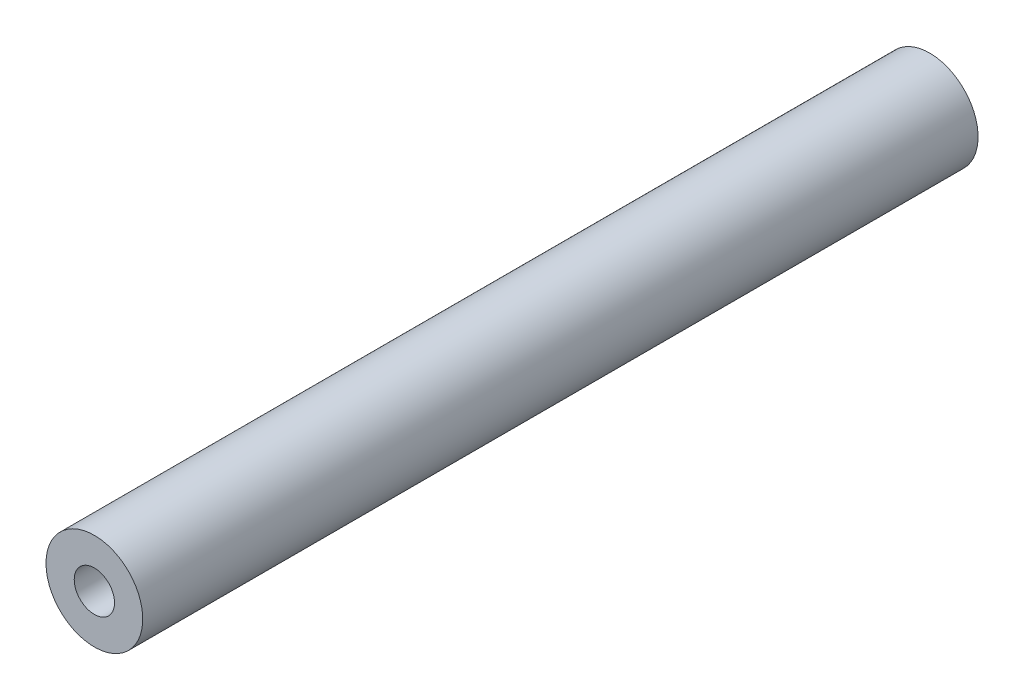
ISO-10303-21;
HEADER;
FILE_DESCRIPTION(('STEP AP214'),'2;1');
FILE_NAME('part.step','',(''),(''),'','','');
FILE_SCHEMA(('AUTOMOTIVE_DESIGN { 1 0 10303 214 1 1 1 1 }'));
ENDSEC;
DATA;
#1=APPLICATION_CONTEXT('core data for automotive mechanical design processes');
#2=APPLICATION_PROTOCOL_DEFINITION('international standard','automotive_design',2000,#1);
#3=PRODUCT_CONTEXT('',#1,'mechanical');
#4=PRODUCT('Part','Part','',(#3));
#5=PRODUCT_RELATED_PRODUCT_CATEGORY('part','',(#4));
#6=PRODUCT_DEFINITION_FORMATION('','',#4);
#7=PRODUCT_DEFINITION_CONTEXT('part definition',#1,'design');
#8=PRODUCT_DEFINITION('design','',#6,#7);
#9=PRODUCT_DEFINITION_SHAPE('','',#8);
#10=(LENGTH_UNIT() NAMED_UNIT(*) SI_UNIT(.MILLI.,.METRE.));
#11=(NAMED_UNIT(*) PLANE_ANGLE_UNIT() SI_UNIT($,.RADIAN.));
#12=(NAMED_UNIT(*) SI_UNIT($,.STERADIAN.) SOLID_ANGLE_UNIT());
#13=UNCERTAINTY_MEASURE_WITH_UNIT(LENGTH_MEASURE(1.E-05),#10,'distance_accuracy_value','');
#14=(GEOMETRIC_REPRESENTATION_CONTEXT(3) GLOBAL_UNCERTAINTY_ASSIGNED_CONTEXT((#13)) GLOBAL_UNIT_ASSIGNED_CONTEXT((#10,
#11,#12)) REPRESENTATION_CONTEXT('',''));
#15=CARTESIAN_POINT('',(0.,0.,0.));
#16=DIRECTION('',(0.,0.,1.));
#17=DIRECTION('',(1.,0.,0.));
#18=AXIS2_PLACEMENT_3D('',#15,#16,#17);
#19=CARTESIAN_POINT('',(0.,0.,51.8));
#20=DIRECTION('',(0.,0.,1.));
#21=DIRECTION('',(1.,0.,0.));
#22=AXIS2_PLACEMENT_3D('',#19,#20,#21);
#23=PLANE('',#22);
#24=CARTESIAN_POINT('',(0.,0.,51.8));
#25=DIRECTION('',(0.,0.,1.));
#26=DIRECTION('',(1.,0.,0.));
#27=AXIS2_PLACEMENT_3D('',#24,#25,#26);
#28=CIRCLE('',#27,3.);
#29=CARTESIAN_POINT('',(-3.,0.,51.8));
#30=VERTEX_POINT('',#29);
#31=EDGE_CURVE('E10',#30,#30,#28,.T.);
#32=ORIENTED_EDGE('',*,*,#31,.T.);
#33=EDGE_LOOP('',(#32));
#34=FACE_BOUND('',#33,.T.);
#35=CARTESIAN_POINT('',(0.,0.,51.8));
#36=DIRECTION('',(0.,0.,1.));
#37=DIRECTION('',(1.,0.,0.));
#38=AXIS2_PLACEMENT_3D('',#35,#36,#37);
#39=CIRCLE('',#38,1.25);
#40=CARTESIAN_POINT('',(-1.25,0.,51.8));
#41=VERTEX_POINT('',#40);
#42=EDGE_CURVE('E52',#41,#41,#39,.T.);
#43=ORIENTED_EDGE('',*,*,#42,.F.);
#44=EDGE_LOOP('',(#43));
#45=FACE_BOUND('',#44,.T.);
#46=ADVANCED_FACE('F39',(#34,#45),#23,.T.);
#47=CARTESIAN_POINT('',(0.,0.,0.));
#48=DIRECTION('',(0.,0.,1.));
#49=DIRECTION('',(1.,0.,0.));
#50=AXIS2_PLACEMENT_3D('',#47,#48,#49);
#51=PLANE('',#50);
#52=CARTESIAN_POINT('',(0.,0.,0.));
#53=DIRECTION('',(0.,0.,1.));
#54=DIRECTION('',(1.,0.,0.));
#55=AXIS2_PLACEMENT_3D('',#52,#53,#54);
#56=CIRCLE('',#55,3.);
#57=CARTESIAN_POINT('',(-3.,0.,0.));
#58=VERTEX_POINT('',#57);
#59=EDGE_CURVE('E43',#58,#58,#56,.T.);
#60=ORIENTED_EDGE('',*,*,#59,.F.);
#61=EDGE_LOOP('',(#60));
#62=FACE_BOUND('',#61,.T.);
#63=CARTESIAN_POINT('',(0.,0.,0.));
#64=DIRECTION('',(0.,0.,1.));
#65=DIRECTION('',(1.,0.,0.));
#66=AXIS2_PLACEMENT_3D('',#63,#64,#65);
#67=CIRCLE('',#66,1.25);
#68=CARTESIAN_POINT('',(-1.25,0.,0.));
#69=VERTEX_POINT('',#68);
#70=EDGE_CURVE('E54',#69,#69,#67,.T.);
#71=ORIENTED_EDGE('',*,*,#70,.T.);
#72=EDGE_LOOP('',(#71));
#73=FACE_BOUND('',#72,.T.);
#74=ADVANCED_FACE('F66',(#62,#73),#51,.F.);
#75=CARTESIAN_POINT('',(0.,0.,51.8));
#76=DIRECTION('',(0.,0.,-1.));
#77=DIRECTION('',(-1.,0.,0.));
#78=AXIS2_PLACEMENT_3D('',#75,#76,#77);
#79=CYLINDRICAL_SURFACE('',#78,3.);
#80=CARTESIAN_POINT('',(-3.,0.,51.8));
#81=CARTESIAN_POINT('',(-3.,0.,51.2604166666667));
#82=CARTESIAN_POINT('',(-3.,0.,50.7208333333333));
#83=CARTESIAN_POINT('',(-3.,0.,49.6416666666667));
#84=CARTESIAN_POINT('',(-3.,0.,49.1020833333333));
#85=CARTESIAN_POINT('',(-3.,0.,48.0229166666667));
#86=CARTESIAN_POINT('',(-3.,0.,47.4833333333333));
#87=CARTESIAN_POINT('',(-3.,0.,46.4041666666667));
#88=CARTESIAN_POINT('',(-3.,0.,45.8645833333333));
#89=CARTESIAN_POINT('',(-3.,0.,44.7854166666667));
#90=CARTESIAN_POINT('',(-3.,0.,44.2458333333333));
#91=CARTESIAN_POINT('',(-3.,0.,43.1666666666667));
#92=CARTESIAN_POINT('',(-3.,0.,42.6270833333333));
#93=CARTESIAN_POINT('',(-3.,0.,41.5479166666667));
#94=CARTESIAN_POINT('',(-3.,0.,41.0083333333333));
#95=CARTESIAN_POINT('',(-3.,0.,39.9291666666667));
#96=CARTESIAN_POINT('',(-3.,0.,39.3895833333333));
#97=CARTESIAN_POINT('',(-3.,0.,38.3104166666667));
#98=CARTESIAN_POINT('',(-3.,0.,37.7708333333333));
#99=CARTESIAN_POINT('',(-3.,0.,36.6916666666667));
#100=CARTESIAN_POINT('',(-3.,0.,36.1520833333333));
#101=CARTESIAN_POINT('',(-3.,0.,35.0729166666667));
#102=CARTESIAN_POINT('',(-3.,0.,34.5333333333333));
#103=CARTESIAN_POINT('',(-3.,0.,33.4541666666667));
#104=CARTESIAN_POINT('',(-3.,0.,32.9145833333333));
#105=CARTESIAN_POINT('',(-3.,0.,31.8354166666667));
#106=CARTESIAN_POINT('',(-3.,0.,31.2958333333333));
#107=CARTESIAN_POINT('',(-3.,0.,30.2166666666667));
#108=CARTESIAN_POINT('',(-3.,0.,29.6770833333333));
#109=CARTESIAN_POINT('',(-3.,0.,28.5979166666667));
#110=CARTESIAN_POINT('',(-3.,0.,28.0583333333333));
#111=CARTESIAN_POINT('',(-3.,0.,26.9791666666667));
#112=CARTESIAN_POINT('',(-3.,0.,26.4395833333333));
#113=CARTESIAN_POINT('',(-3.,0.,25.3604166666667));
#114=CARTESIAN_POINT('',(-3.,0.,24.8208333333333));
#115=CARTESIAN_POINT('',(-3.,0.,23.7416666666667));
#116=CARTESIAN_POINT('',(-3.,0.,23.2020833333333));
#117=CARTESIAN_POINT('',(-3.,0.,22.1229166666667));
#118=CARTESIAN_POINT('',(-3.,0.,21.5833333333333));
#119=CARTESIAN_POINT('',(-3.,0.,20.5041666666667));
#120=CARTESIAN_POINT('',(-3.,0.,19.9645833333333));
#121=CARTESIAN_POINT('',(-3.,0.,18.8854166666667));
#122=CARTESIAN_POINT('',(-3.,0.,18.3458333333333));
#123=CARTESIAN_POINT('',(-3.,0.,17.2666666666667));
#124=CARTESIAN_POINT('',(-3.,0.,16.7270833333333));
#125=CARTESIAN_POINT('',(-3.,0.,15.6479166666667));
#126=CARTESIAN_POINT('',(-3.,0.,15.1083333333333));
#127=CARTESIAN_POINT('',(-3.,0.,14.0291666666667));
#128=CARTESIAN_POINT('',(-3.,0.,13.4895833333333));
#129=CARTESIAN_POINT('',(-3.,0.,12.4104166666667));
#130=CARTESIAN_POINT('',(-3.,0.,11.8708333333333));
#131=CARTESIAN_POINT('',(-3.,0.,10.7916666666667));
#132=CARTESIAN_POINT('',(-3.,0.,10.2520833333333));
#133=CARTESIAN_POINT('',(-3.,0.,9.17291666666666));
#134=CARTESIAN_POINT('',(-3.,0.,8.63333333333333));
#135=CARTESIAN_POINT('',(-3.,0.,7.55416666666666));
#136=CARTESIAN_POINT('',(-3.,0.,7.01458333333333));
#137=CARTESIAN_POINT('',(-3.,0.,5.93541666666666));
#138=CARTESIAN_POINT('',(-3.,0.,5.39583333333333));
#139=CARTESIAN_POINT('',(-3.,0.,4.31666666666666));
#140=CARTESIAN_POINT('',(-3.,0.,3.77708333333332));
#141=CARTESIAN_POINT('',(-3.,0.,2.69791666666666));
#142=CARTESIAN_POINT('',(-3.,0.,2.15833333333333));
#143=CARTESIAN_POINT('',(-3.,0.,1.07916666666666));
#144=CARTESIAN_POINT('',(-3.,0.,0.539583333333327));
#145=CARTESIAN_POINT('',(-3.,0.,0.));
#146=B_SPLINE_CURVE_WITH_KNOTS('',3,(#80,#81,#82,#83,#84,#85,#86,#87,#88,#89,#90,#91,#92,#93,
#94,#95,#96,#97,#98,#99,#100,#101,#102,#103,#104,#105,#106,#107,#108,#109,#110,#111,#112,#113,
#114,#115,#116,#117,#118,#119,#120,#121,#122,#123,#124,#125,#126,#127,#128,#129,#130,#131,#132,
#133,#134,#135,#136,#137,#138,#139,#140,#141,#142,#143,#144,#145),.UNSPECIFIED.,.F.,.F.,(4,2,2,
2,2,2,2,2,2,2,2,2,2,2,2,2,2,2,2,2,2,2,2,2,2,2,2,2,2,2,2,2,4),(0.,1.61875,3.2375,4.85625,
6.47499999999999,8.09375,9.71249999999999,11.33125,12.95,14.56875,16.1875,17.80625,19.425,
21.04375,22.6625,24.28125,25.9,27.51875,29.1375,30.75625,32.375,33.99375,35.6125,37.23125,38.85,
40.46875,42.0875,43.70625,45.325,46.94375,48.5625,50.18125,51.8),.UNSPECIFIED.);
#147=EDGE_CURVE('BSEAM41',#30,#58,#146,.T.);
#148=ORIENTED_EDGE('',*,*,#31,.F.);
#149=ORIENTED_EDGE('',*,*,#59,.T.);
#150=ORIENTED_EDGE('',*,*,#147,.T.);
#151=ORIENTED_EDGE('',*,*,#147,.F.);
#152=EDGE_LOOP('',(#148,#150,#149,#151));
#153=FACE_BOUND('',#152,.T.);
#154=ADVANCED_FACE('F41',(#153),#79,.T.);
#155=CARTESIAN_POINT('',(0.,0.,51.8));
#156=DIRECTION('',(0.,0.,-1.));
#157=DIRECTION('',(-1.,0.,0.));
#158=AXIS2_PLACEMENT_3D('',#155,#156,#157);
#159=CYLINDRICAL_SURFACE('',#158,1.25);
#160=CARTESIAN_POINT('',(-1.25,0.,51.8));
#161=CARTESIAN_POINT('',(-1.25,0.,51.2604166666667));
#162=CARTESIAN_POINT('',(-1.25,0.,50.7208333333333));
#163=CARTESIAN_POINT('',(-1.25,0.,49.6416666666667));
#164=CARTESIAN_POINT('',(-1.25,0.,49.1020833333333));
#165=CARTESIAN_POINT('',(-1.25,0.,48.0229166666667));
#166=CARTESIAN_POINT('',(-1.25,0.,47.4833333333333));
#167=CARTESIAN_POINT('',(-1.25,0.,46.4041666666667));
#168=CARTESIAN_POINT('',(-1.25,0.,45.8645833333333));
#169=CARTESIAN_POINT('',(-1.25,0.,44.7854166666667));
#170=CARTESIAN_POINT('',(-1.25,0.,44.2458333333333));
#171=CARTESIAN_POINT('',(-1.25,0.,43.1666666666667));
#172=CARTESIAN_POINT('',(-1.25,0.,42.6270833333333));
#173=CARTESIAN_POINT('',(-1.25,0.,41.5479166666667));
#174=CARTESIAN_POINT('',(-1.25,0.,41.0083333333333));
#175=CARTESIAN_POINT('',(-1.25,0.,39.9291666666667));
#176=CARTESIAN_POINT('',(-1.25,0.,39.3895833333333));
#177=CARTESIAN_POINT('',(-1.25,0.,38.3104166666667));
#178=CARTESIAN_POINT('',(-1.25,0.,37.7708333333333));
#179=CARTESIAN_POINT('',(-1.25,0.,36.6916666666667));
#180=CARTESIAN_POINT('',(-1.25,0.,36.1520833333333));
#181=CARTESIAN_POINT('',(-1.25,0.,35.0729166666667));
#182=CARTESIAN_POINT('',(-1.25,0.,34.5333333333333));
#183=CARTESIAN_POINT('',(-1.25,0.,33.4541666666667));
#184=CARTESIAN_POINT('',(-1.25,0.,32.9145833333333));
#185=CARTESIAN_POINT('',(-1.25,0.,31.8354166666667));
#186=CARTESIAN_POINT('',(-1.25,0.,31.2958333333333));
#187=CARTESIAN_POINT('',(-1.25,0.,30.2166666666667));
#188=CARTESIAN_POINT('',(-1.25,0.,29.6770833333333));
#189=CARTESIAN_POINT('',(-1.25,0.,28.5979166666667));
#190=CARTESIAN_POINT('',(-1.25,0.,28.0583333333333));
#191=CARTESIAN_POINT('',(-1.25,0.,26.9791666666667));
#192=CARTESIAN_POINT('',(-1.25,0.,26.4395833333333));
#193=CARTESIAN_POINT('',(-1.25,0.,25.3604166666667));
#194=CARTESIAN_POINT('',(-1.25,0.,24.8208333333333));
#195=CARTESIAN_POINT('',(-1.25,0.,23.7416666666667));
#196=CARTESIAN_POINT('',(-1.25,0.,23.2020833333333));
#197=CARTESIAN_POINT('',(-1.25,0.,22.1229166666667));
#198=CARTESIAN_POINT('',(-1.25,0.,21.5833333333333));
#199=CARTESIAN_POINT('',(-1.25,0.,20.5041666666667));
#200=CARTESIAN_POINT('',(-1.25,0.,19.9645833333333));
#201=CARTESIAN_POINT('',(-1.25,0.,18.8854166666667));
#202=CARTESIAN_POINT('',(-1.25,0.,18.3458333333333));
#203=CARTESIAN_POINT('',(-1.25,0.,17.2666666666667));
#204=CARTESIAN_POINT('',(-1.25,0.,16.7270833333333));
#205=CARTESIAN_POINT('',(-1.25,0.,15.6479166666667));
#206=CARTESIAN_POINT('',(-1.25,0.,15.1083333333333));
#207=CARTESIAN_POINT('',(-1.25,0.,14.0291666666667));
#208=CARTESIAN_POINT('',(-1.25,0.,13.4895833333333));
#209=CARTESIAN_POINT('',(-1.25,0.,12.4104166666667));
#210=CARTESIAN_POINT('',(-1.25,0.,11.8708333333333));
#211=CARTESIAN_POINT('',(-1.25,0.,10.7916666666667));
#212=CARTESIAN_POINT('',(-1.25,0.,10.2520833333333));
#213=CARTESIAN_POINT('',(-1.25,0.,9.17291666666666));
#214=CARTESIAN_POINT('',(-1.25,0.,8.63333333333333));
#215=CARTESIAN_POINT('',(-1.25,0.,7.55416666666666));
#216=CARTESIAN_POINT('',(-1.25,0.,7.01458333333333));
#217=CARTESIAN_POINT('',(-1.25,0.,5.93541666666666));
#218=CARTESIAN_POINT('',(-1.25,0.,5.39583333333333));
#219=CARTESIAN_POINT('',(-1.25,0.,4.31666666666666));
#220=CARTESIAN_POINT('',(-1.25,0.,3.77708333333332));
#221=CARTESIAN_POINT('',(-1.25,0.,2.69791666666666));
#222=CARTESIAN_POINT('',(-1.25,0.,2.15833333333333));
#223=CARTESIAN_POINT('',(-1.25,0.,1.07916666666666));
#224=CARTESIAN_POINT('',(-1.25,0.,0.539583333333327));
#225=CARTESIAN_POINT('',(-1.25,0.,0.));
#226=B_SPLINE_CURVE_WITH_KNOTS('',3,(#160,#161,#162,#163,#164,#165,#166,#167,#168,#169,#170,
#171,#172,#173,#174,#175,#176,#177,#178,#179,#180,#181,#182,#183,#184,#185,#186,#187,#188,#189,
#190,#191,#192,#193,#194,#195,#196,#197,#198,#199,#200,#201,#202,#203,#204,#205,#206,#207,#208,
#209,#210,#211,#212,#213,#214,#215,#216,#217,#218,#219,#220,#221,#222,#223,#224,#225),
.UNSPECIFIED.,.F.,.F.,(4,2,2,2,2,2,2,2,2,2,2,2,2,2,2,2,2,2,2,2,2,2,2,2,2,2,2,2,2,2,2,2,4),(0.,
1.61875,3.2375,4.85625,6.47499999999999,8.09375,9.71249999999999,11.33125,12.95,14.56875,
16.1875,17.80625,19.425,21.04375,22.6625,24.28125,25.9,27.51875,29.1375,30.75625,32.375,
33.99375,35.6125,37.23125,38.85,40.46875,42.0875,43.70625,45.325,46.94375,48.5625,50.18125,
51.8),.UNSPECIFIED.);
#227=EDGE_CURVE('BSEAM62',#41,#69,#226,.T.);
#228=ORIENTED_EDGE('',*,*,#42,.T.);
#229=ORIENTED_EDGE('',*,*,#70,.F.);
#230=ORIENTED_EDGE('',*,*,#227,.T.);
#231=ORIENTED_EDGE('',*,*,#227,.F.);
#232=EDGE_LOOP('',(#228,#230,#229,#231));
#233=FACE_BOUND('',#232,.T.);
#234=ADVANCED_FACE('F62',(#233),#159,.F.);
#235=CLOSED_SHELL('',(#46,#74,#154,#234));
#236=MANIFOLD_SOLID_BREP('B2',#235);
#237=ADVANCED_BREP_SHAPE_REPRESENTATION('',(#18,#236),#14);
#238=SHAPE_DEFINITION_REPRESENTATION(#9,#237);
ENDSEC;
END-ISO-10303-21;
